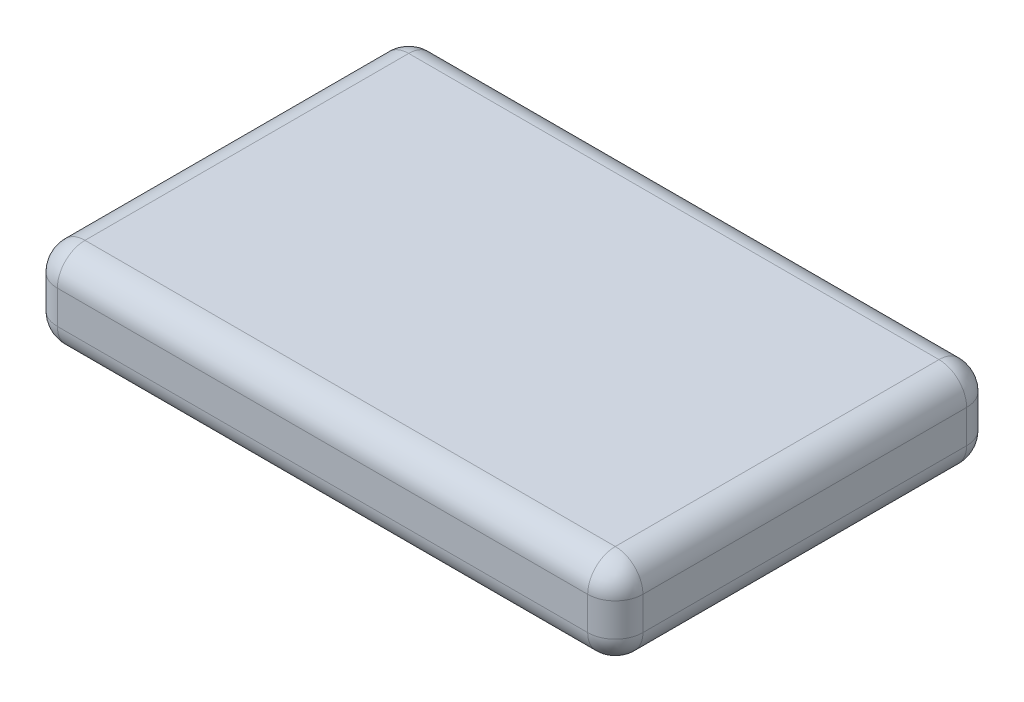
ISO-10303-21;
HEADER;
FILE_DESCRIPTION(('STEP AP214'),'2;1');
FILE_NAME('part.step','',(''),(''),'','','');
FILE_SCHEMA(('AUTOMOTIVE_DESIGN { 1 0 10303 214 1 1 1 1 }'));
ENDSEC;
DATA;
#1=APPLICATION_CONTEXT('core data for automotive mechanical design processes');
#2=APPLICATION_PROTOCOL_DEFINITION('international standard','automotive_design',2000,#1);
#3=PRODUCT_CONTEXT('',#1,'mechanical');
#4=PRODUCT('Part','Part','',(#3));
#5=PRODUCT_RELATED_PRODUCT_CATEGORY('part','',(#4));
#6=PRODUCT_DEFINITION_FORMATION('','',#4);
#7=PRODUCT_DEFINITION_CONTEXT('part definition',#1,'design');
#8=PRODUCT_DEFINITION('design','',#6,#7);
#9=PRODUCT_DEFINITION_SHAPE('','',#8);
#10=(LENGTH_UNIT() NAMED_UNIT(*) SI_UNIT(.MILLI.,.METRE.));
#11=(NAMED_UNIT(*) PLANE_ANGLE_UNIT() SI_UNIT($,.RADIAN.));
#12=(NAMED_UNIT(*) SI_UNIT($,.STERADIAN.) SOLID_ANGLE_UNIT());
#13=UNCERTAINTY_MEASURE_WITH_UNIT(LENGTH_MEASURE(1.E-05),#10,'distance_accuracy_value','');
#14=(GEOMETRIC_REPRESENTATION_CONTEXT(3) GLOBAL_UNCERTAINTY_ASSIGNED_CONTEXT((#13)) GLOBAL_UNIT_ASSIGNED_CONTEXT((#10,
#11,#12)) REPRESENTATION_CONTEXT('',''));
#15=CARTESIAN_POINT('',(0.,0.,0.));
#16=DIRECTION('',(0.,0.,1.));
#17=DIRECTION('',(1.,0.,0.));
#18=AXIS2_PLACEMENT_3D('',#15,#16,#17);
#19=CARTESIAN_POINT('',(53.,8.,34.3));
#20=DIRECTION('',(-1.,0.,0.));
#21=DIRECTION('',(0.,0.,1.));
#22=AXIS2_PLACEMENT_3D('',#19,#20,#21);
#23=PLANE('',#22);
#24=DIRECTION('',(0.,-1.,0.));
#25=VECTOR('',#24,1.);
#26=CARTESIAN_POINT('',(53.,8.,29.3));
#27=LINE('',#26,#25);
#28=CARTESIAN_POINT('',(53.,3.,29.3));
#29=VERTEX_POINT('',#28);
#30=CARTESIAN_POINT('',(53.,-3.,29.3));
#31=VERTEX_POINT('',#30);
#32=EDGE_CURVE('E136',#29,#31,#27,.T.);
#33=ORIENTED_EDGE('',*,*,#32,.T.);
#34=DIRECTION('',(0.,0.,-1.));
#35=VECTOR('',#34,1.);
#36=CARTESIAN_POINT('',(53.,-3.,-29.3));
#37=LINE('',#36,#35);
#38=CARTESIAN_POINT('',(53.,-3.,-29.3));
#39=VERTEX_POINT('',#38);
#40=EDGE_CURVE('E132',#31,#39,#37,.T.);
#41=ORIENTED_EDGE('',*,*,#40,.T.);
#42=DIRECTION('',(0.,-1.,0.));
#43=VECTOR('',#42,1.);
#44=CARTESIAN_POINT('',(53.,8.,-29.3));
#45=LINE('',#44,#43);
#46=CARTESIAN_POINT('',(53.,3.,-29.3));
#47=VERTEX_POINT('',#46);
#48=EDGE_CURVE('E134',#39,#47,#45,.F.);
#49=ORIENTED_EDGE('',*,*,#48,.T.);
#50=DIRECTION('',(0.,0.,-1.));
#51=VECTOR('',#50,1.);
#52=CARTESIAN_POINT('',(53.,3.,34.3));
#53=LINE('',#52,#51);
#54=EDGE_CURVE('E141',#47,#29,#53,.F.);
#55=ORIENTED_EDGE('',*,*,#54,.T.);
#56=EDGE_LOOP('',(#33,#41,#49,#55));
#57=FACE_BOUND('',#56,.T.);
#58=ADVANCED_FACE('F41',(#57),#23,.F.);
#59=CARTESIAN_POINT('',(-53.,8.,-34.3));
#60=DIRECTION('',(0.,0.,1.));
#61=DIRECTION('',(1.,0.,0.));
#62=AXIS2_PLACEMENT_3D('',#59,#60,#61);
#63=PLANE('',#62);
#64=DIRECTION('',(0.,-1.,0.));
#65=VECTOR('',#64,1.);
#66=CARTESIAN_POINT('',(-48.,8.,-34.3));
#67=LINE('',#66,#65);
#68=CARTESIAN_POINT('',(-48.,-3.,-34.3));
#69=VERTEX_POINT('',#68);
#70=CARTESIAN_POINT('',(-48.,3.,-34.3));
#71=VERTEX_POINT('',#70);
#72=EDGE_CURVE('E230',#69,#71,#67,.F.);
#73=ORIENTED_EDGE('',*,*,#72,.T.);
#74=DIRECTION('',(-1.,0.,0.));
#75=VECTOR('',#74,1.);
#76=CARTESIAN_POINT('',(-53.,3.,-34.3));
#77=LINE('',#76,#75);
#78=CARTESIAN_POINT('',(48.,3.,-34.3));
#79=VERTEX_POINT('',#78);
#80=EDGE_CURVE('E11',#71,#79,#77,.F.);
#81=ORIENTED_EDGE('',*,*,#80,.T.);
#82=DIRECTION('',(0.,-1.,0.));
#83=VECTOR('',#82,1.);
#84=CARTESIAN_POINT('',(48.,8.,-34.3));
#85=LINE('',#84,#83);
#86=CARTESIAN_POINT('',(48.,-3.,-34.3));
#87=VERTEX_POINT('',#86);
#88=EDGE_CURVE('E232',#79,#87,#85,.T.);
#89=ORIENTED_EDGE('',*,*,#88,.T.);
#90=DIRECTION('',(-1.,0.,0.));
#91=VECTOR('',#90,1.);
#92=CARTESIAN_POINT('',(-48.,-3.,-34.3));
#93=LINE('',#92,#91);
#94=EDGE_CURVE('E50',#87,#69,#93,.T.);
#95=ORIENTED_EDGE('',*,*,#94,.T.);
#96=EDGE_LOOP('',(#73,#81,#89,#95));
#97=FACE_BOUND('',#96,.T.);
#98=ADVANCED_FACE('F229',(#97),#63,.F.);
#99=CARTESIAN_POINT('',(-53.,8.,34.3));
#100=DIRECTION('',(1.,0.,0.));
#101=DIRECTION('',(0.,0.,-1.));
#102=AXIS2_PLACEMENT_3D('',#99,#100,#101);
#103=PLANE('',#102);
#104=DIRECTION('',(0.,-1.,0.));
#105=VECTOR('',#104,1.);
#106=CARTESIAN_POINT('',(-53.,8.,-29.3));
#107=LINE('',#106,#105);
#108=CARTESIAN_POINT('',(-53.,3.,-29.3));
#109=VERTEX_POINT('',#108);
#110=CARTESIAN_POINT('',(-53.,-3.,-29.3));
#111=VERTEX_POINT('',#110);
#112=EDGE_CURVE('E571',#109,#111,#107,.T.);
#113=ORIENTED_EDGE('',*,*,#112,.T.);
#114=DIRECTION('',(0.,0.,1.));
#115=VECTOR('',#114,1.);
#116=CARTESIAN_POINT('',(-53.,-3.,29.3));
#117=LINE('',#116,#115);
#118=CARTESIAN_POINT('',(-53.,-3.,29.3));
#119=VERTEX_POINT('',#118);
#120=EDGE_CURVE('E271',#111,#119,#117,.T.);
#121=ORIENTED_EDGE('',*,*,#120,.T.);
#122=DIRECTION('',(0.,-1.,0.));
#123=VECTOR('',#122,1.);
#124=CARTESIAN_POINT('',(-53.,8.,29.3));
#125=LINE('',#124,#123);
#126=CARTESIAN_POINT('',(-53.,3.,29.3));
#127=VERTEX_POINT('',#126);
#128=EDGE_CURVE('E190',#119,#127,#125,.F.);
#129=ORIENTED_EDGE('',*,*,#128,.T.);
#130=DIRECTION('',(0.,0.,1.));
#131=VECTOR('',#130,1.);
#132=CARTESIAN_POINT('',(-53.,3.,34.3));
#133=LINE('',#132,#131);
#134=EDGE_CURVE('E212',#127,#109,#133,.F.);
#135=ORIENTED_EDGE('',*,*,#134,.T.);
#136=EDGE_LOOP('',(#113,#121,#129,#135));
#137=FACE_BOUND('',#136,.T.);
#138=ADVANCED_FACE('F299',(#137),#103,.F.);
#139=CARTESIAN_POINT('',(-53.,8.,34.3));
#140=DIRECTION('',(0.,0.,-1.));
#141=DIRECTION('',(-1.,0.,0.));
#142=AXIS2_PLACEMENT_3D('',#139,#140,#141);
#143=PLANE('',#142);
#144=DIRECTION('',(0.,-1.,0.));
#145=VECTOR('',#144,1.);
#146=CARTESIAN_POINT('',(-48.,8.,34.3));
#147=LINE('',#146,#145);
#148=CARTESIAN_POINT('',(-48.,3.,34.3));
#149=VERTEX_POINT('',#148);
#150=CARTESIAN_POINT('',(-48.,-3.,34.3));
#151=VERTEX_POINT('',#150);
#152=EDGE_CURVE('E153',#149,#151,#147,.T.);
#153=ORIENTED_EDGE('',*,*,#152,.T.);
#154=DIRECTION('',(1.,0.,0.));
#155=VECTOR('',#154,1.);
#156=CARTESIAN_POINT('',(48.,-3.,34.3));
#157=LINE('',#156,#155);
#158=CARTESIAN_POINT('',(48.,-3.,34.3));
#159=VERTEX_POINT('',#158);
#160=EDGE_CURVE('E265',#151,#159,#157,.T.);
#161=ORIENTED_EDGE('',*,*,#160,.T.);
#162=DIRECTION('',(0.,-1.,0.));
#163=VECTOR('',#162,1.);
#164=CARTESIAN_POINT('',(48.,8.,34.3));
#165=LINE('',#164,#163);
#166=CARTESIAN_POINT('',(48.,3.,34.3));
#167=VERTEX_POINT('',#166);
#168=EDGE_CURVE('E585',#159,#167,#165,.F.);
#169=ORIENTED_EDGE('',*,*,#168,.T.);
#170=DIRECTION('',(1.,0.,0.));
#171=VECTOR('',#170,1.);
#172=CARTESIAN_POINT('',(-53.,3.,34.3));
#173=LINE('',#172,#171);
#174=EDGE_CURVE('E263',#167,#149,#173,.F.);
#175=ORIENTED_EDGE('',*,*,#174,.T.);
#176=EDGE_LOOP('',(#153,#161,#169,#175));
#177=FACE_BOUND('',#176,.T.);
#178=ADVANCED_FACE('F515',(#177),#143,.F.);
#179=CARTESIAN_POINT('',(0.,8.,0.));
#180=DIRECTION('',(0.,-1.,0.));
#181=DIRECTION('',(0.,0.,-1.));
#182=AXIS2_PLACEMENT_3D('',#179,#180,#181);
#183=PLANE('',#182);
#184=DIRECTION('',(1.,0.,0.));
#185=VECTOR('',#184,1.);
#186=CARTESIAN_POINT('',(0.,8.,29.3));
#187=LINE('',#186,#185);
#188=CARTESIAN_POINT('',(-48.,8.,29.3));
#189=VERTEX_POINT('',#188);
#190=CARTESIAN_POINT('',(48.,8.,29.3));
#191=VERTEX_POINT('',#190);
#192=EDGE_CURVE('E58',#189,#191,#187,.T.);
#193=ORIENTED_EDGE('',*,*,#192,.T.);
#194=DIRECTION('',(0.,0.,-1.));
#195=VECTOR('',#194,1.);
#196=CARTESIAN_POINT('',(48.,8.,0.));
#197=LINE('',#196,#195);
#198=CARTESIAN_POINT('',(48.,8.,-29.3));
#199=VERTEX_POINT('',#198);
#200=EDGE_CURVE('E220',#191,#199,#197,.T.);
#201=ORIENTED_EDGE('',*,*,#200,.T.);
#202=DIRECTION('',(-1.,0.,0.));
#203=VECTOR('',#202,1.);
#204=CARTESIAN_POINT('',(0.,8.,-29.3));
#205=LINE('',#204,#203);
#206=CARTESIAN_POINT('',(-48.,8.,-29.3));
#207=VERTEX_POINT('',#206);
#208=EDGE_CURVE('E223',#199,#207,#205,.T.);
#209=ORIENTED_EDGE('',*,*,#208,.T.);
#210=DIRECTION('',(0.,0.,1.));
#211=VECTOR('',#210,1.);
#212=CARTESIAN_POINT('',(-48.,8.,0.));
#213=LINE('',#212,#211);
#214=EDGE_CURVE('E63',#207,#189,#213,.T.);
#215=ORIENTED_EDGE('',*,*,#214,.T.);
#216=EDGE_LOOP('',(#193,#201,#209,#215));
#217=FACE_BOUND('',#216,.T.);
#218=ADVANCED_FACE('F274',(#217),#183,.F.);
#219=CARTESIAN_POINT('',(0.,-8.,0.));
#220=DIRECTION('',(0.,-1.,0.));
#221=DIRECTION('',(0.,0.,-1.));
#222=AXIS2_PLACEMENT_3D('',#219,#220,#221);
#223=PLANE('',#222);
#224=DIRECTION('',(-1.,0.,0.));
#225=VECTOR('',#224,1.);
#226=CARTESIAN_POINT('',(48.,-8.,-29.3));
#227=LINE('',#226,#225);
#228=CARTESIAN_POINT('',(-48.,-8.,-29.3));
#229=VERTEX_POINT('',#228);
#230=CARTESIAN_POINT('',(48.,-8.,-29.3));
#231=VERTEX_POINT('',#230);
#232=EDGE_CURVE('E140',#229,#231,#227,.F.);
#233=ORIENTED_EDGE('',*,*,#232,.T.);
#234=DIRECTION('',(0.,0.,-1.));
#235=VECTOR('',#234,1.);
#236=CARTESIAN_POINT('',(48.,-8.,29.3));
#237=LINE('',#236,#235);
#238=CARTESIAN_POINT('',(48.,-8.,29.3));
#239=VERTEX_POINT('',#238);
#240=EDGE_CURVE('E166',#231,#239,#237,.F.);
#241=ORIENTED_EDGE('',*,*,#240,.T.);
#242=DIRECTION('',(1.,0.,0.));
#243=VECTOR('',#242,1.);
#244=CARTESIAN_POINT('',(-48.,-8.,29.3));
#245=LINE('',#244,#243);
#246=CARTESIAN_POINT('',(-48.,-8.,29.3));
#247=VERTEX_POINT('',#246);
#248=EDGE_CURVE('E253',#239,#247,#245,.F.);
#249=ORIENTED_EDGE('',*,*,#248,.T.);
#250=DIRECTION('',(0.,0.,1.));
#251=VECTOR('',#250,1.);
#252=CARTESIAN_POINT('',(-48.,-8.,-29.3));
#253=LINE('',#252,#251);
#254=EDGE_CURVE('E251',#247,#229,#253,.F.);
#255=ORIENTED_EDGE('',*,*,#254,.T.);
#256=EDGE_LOOP('',(#233,#241,#249,#255));
#257=FACE_BOUND('',#256,.T.);
#258=ADVANCED_FACE('F305',(#257),#223,.T.);
#259=CARTESIAN_POINT('',(-48.,8.,-29.3));
#260=DIRECTION('',(0.,-1.,0.));
#261=DIRECTION('',(0.,0.,-1.));
#262=AXIS2_PLACEMENT_3D('',#259,#260,#261);
#263=CYLINDRICAL_SURFACE('',#262,5.);
#264=ORIENTED_EDGE('',*,*,#72,.F.);
#265=CARTESIAN_POINT('',(-48.,-3.,-29.3));
#266=DIRECTION('',(0.,-1.,0.));
#267=DIRECTION('',(0.,0.,-1.));
#268=AXIS2_PLACEMENT_3D('',#265,#266,#267);
#269=CIRCLE('',#268,5.);
#270=EDGE_CURVE('E238',#69,#111,#269,.F.);
#271=ORIENTED_EDGE('',*,*,#270,.T.);
#272=ORIENTED_EDGE('',*,*,#112,.F.);
#273=CARTESIAN_POINT('',(-48.,3.,-29.3));
#274=DIRECTION('',(0.,-1.,0.));
#275=DIRECTION('',(0.,0.,-1.));
#276=AXIS2_PLACEMENT_3D('',#273,#274,#275);
#277=CIRCLE('',#276,5.);
#278=EDGE_CURVE('E241',#109,#71,#277,.T.);
#279=ORIENTED_EDGE('',*,*,#278,.T.);
#280=EDGE_LOOP('',(#264,#271,#272,#279));
#281=FACE_BOUND('',#280,.T.);
#282=ADVANCED_FACE('F236',(#281),#263,.T.);
#283=CARTESIAN_POINT('',(48.,8.,-29.3));
#284=DIRECTION('',(0.,-1.,0.));
#285=DIRECTION('',(0.,0.,-1.));
#286=AXIS2_PLACEMENT_3D('',#283,#284,#285);
#287=CYLINDRICAL_SURFACE('',#286,5.);
#288=ORIENTED_EDGE('',*,*,#48,.F.);
#289=CARTESIAN_POINT('',(48.,-3.,-29.3));
#290=DIRECTION('',(0.,-1.,0.));
#291=DIRECTION('',(0.,0.,-1.));
#292=AXIS2_PLACEMENT_3D('',#289,#290,#291);
#293=CIRCLE('',#292,5.);
#294=EDGE_CURVE('E149',#39,#87,#293,.F.);
#295=ORIENTED_EDGE('',*,*,#294,.T.);
#296=ORIENTED_EDGE('',*,*,#88,.F.);
#297=CARTESIAN_POINT('',(48.,3.,-29.3));
#298=DIRECTION('',(0.,-1.,0.));
#299=DIRECTION('',(0.,0.,-1.));
#300=AXIS2_PLACEMENT_3D('',#297,#298,#299);
#301=CIRCLE('',#300,5.);
#302=EDGE_CURVE('E152',#79,#47,#301,.T.);
#303=ORIENTED_EDGE('',*,*,#302,.T.);
#304=EDGE_LOOP('',(#288,#295,#296,#303));
#305=FACE_BOUND('',#304,.T.);
#306=ADVANCED_FACE('F147',(#305),#287,.T.);
#307=CARTESIAN_POINT('',(48.,8.,29.3));
#308=DIRECTION('',(0.,-1.,0.));
#309=DIRECTION('',(0.,0.,-1.));
#310=AXIS2_PLACEMENT_3D('',#307,#308,#309);
#311=CYLINDRICAL_SURFACE('',#310,5.);
#312=ORIENTED_EDGE('',*,*,#168,.F.);
#313=CARTESIAN_POINT('',(48.,-3.,29.3));
#314=DIRECTION('',(0.,-1.,0.));
#315=DIRECTION('',(0.,0.,-1.));
#316=AXIS2_PLACEMENT_3D('',#313,#314,#315);
#317=CIRCLE('',#316,5.);
#318=EDGE_CURVE('E261',#159,#31,#317,.F.);
#319=ORIENTED_EDGE('',*,*,#318,.T.);
#320=ORIENTED_EDGE('',*,*,#32,.F.);
#321=CARTESIAN_POINT('',(48.,3.,29.3));
#322=DIRECTION('',(0.,-1.,0.));
#323=DIRECTION('',(0.,0.,-1.));
#324=AXIS2_PLACEMENT_3D('',#321,#322,#323);
#325=CIRCLE('',#324,5.);
#326=EDGE_CURVE('E259',#29,#167,#325,.T.);
#327=ORIENTED_EDGE('',*,*,#326,.T.);
#328=EDGE_LOOP('',(#312,#319,#320,#327));
#329=FACE_BOUND('',#328,.T.);
#330=ADVANCED_FACE('F308',(#329),#311,.T.);
#331=CARTESIAN_POINT('',(-48.,8.,29.3));
#332=DIRECTION('',(0.,-1.,0.));
#333=DIRECTION('',(0.,0.,-1.));
#334=AXIS2_PLACEMENT_3D('',#331,#332,#333);
#335=CYLINDRICAL_SURFACE('',#334,5.);
#336=ORIENTED_EDGE('',*,*,#128,.F.);
#337=CARTESIAN_POINT('',(-48.,-3.,29.3));
#338=DIRECTION('',(0.,-1.,0.));
#339=DIRECTION('',(0.,0.,-1.));
#340=AXIS2_PLACEMENT_3D('',#337,#338,#339);
#341=CIRCLE('',#340,5.);
#342=EDGE_CURVE('E268',#119,#151,#341,.F.);
#343=ORIENTED_EDGE('',*,*,#342,.T.);
#344=ORIENTED_EDGE('',*,*,#152,.F.);
#345=CARTESIAN_POINT('',(-48.,3.,29.3));
#346=DIRECTION('',(0.,-1.,0.));
#347=DIRECTION('',(0.,0.,-1.));
#348=AXIS2_PLACEMENT_3D('',#345,#346,#347);
#349=CIRCLE('',#348,5.);
#350=EDGE_CURVE('E215',#149,#127,#349,.T.);
#351=ORIENTED_EDGE('',*,*,#350,.T.);
#352=EDGE_LOOP('',(#336,#343,#344,#351));
#353=FACE_BOUND('',#352,.T.);
#354=ADVANCED_FACE('F311',(#353),#335,.T.);
#355=CARTESIAN_POINT('',(-48.,-3.,29.3));
#356=DIRECTION('',(0.,-1.,0.));
#357=DIRECTION('',(0.,0.,-1.));
#358=AXIS2_PLACEMENT_3D('',#355,#356,#357);
#359=SPHERICAL_SURFACE('',#358,5.);
#360=CARTESIAN_POINT('',(-48.,-3.,29.3));
#361=DIRECTION('',(1.,0.,0.));
#362=DIRECTION('',(0.,0.,-1.));
#363=AXIS2_PLACEMENT_3D('',#360,#361,#362);
#364=CIRCLE('',#363,5.);
#365=EDGE_CURVE('E184',#151,#247,#364,.T.);
#366=ORIENTED_EDGE('',*,*,#365,.F.);
#367=ORIENTED_EDGE('',*,*,#342,.F.);
#368=CARTESIAN_POINT('',(-48.,-3.,29.3));
#369=DIRECTION('',(0.,0.,-1.));
#370=DIRECTION('',(-1.,0.,0.));
#371=AXIS2_PLACEMENT_3D('',#368,#369,#370);
#372=CIRCLE('',#371,5.);
#373=EDGE_CURVE('E187',#247,#119,#372,.T.);
#374=ORIENTED_EDGE('',*,*,#373,.F.);
#375=EDGE_LOOP('',(#366,#367,#374));
#376=FACE_BOUND('',#375,.T.);
#377=ADVANCED_FACE('F315',(#376),#359,.T.);
#378=CARTESIAN_POINT('',(-48.,-3.,34.3));
#379=DIRECTION('',(0.,0.,-1.));
#380=DIRECTION('',(-1.,0.,0.));
#381=AXIS2_PLACEMENT_3D('',#378,#379,#380);
#382=CYLINDRICAL_SURFACE('',#381,5.);
#383=ORIENTED_EDGE('',*,*,#373,.T.);
#384=ORIENTED_EDGE('',*,*,#120,.F.);
#385=CARTESIAN_POINT('',(-48.,-3.,-29.3));
#386=DIRECTION('',(0.,0.,-1.));
#387=DIRECTION('',(-1.,0.,0.));
#388=AXIS2_PLACEMENT_3D('',#385,#386,#387);
#389=CIRCLE('',#388,5.);
#390=EDGE_CURVE('E181',#229,#111,#389,.T.);
#391=ORIENTED_EDGE('',*,*,#390,.F.);
#392=ORIENTED_EDGE('',*,*,#254,.F.);
#393=EDGE_LOOP('',(#383,#384,#391,#392));
#394=FACE_BOUND('',#393,.T.);
#395=ADVANCED_FACE('F332',(#394),#382,.T.);
#396=CARTESIAN_POINT('',(-53.,-3.,29.3));
#397=DIRECTION('',(-1.,0.,0.));
#398=DIRECTION('',(0.,0.,1.));
#399=AXIS2_PLACEMENT_3D('',#396,#397,#398);
#400=CYLINDRICAL_SURFACE('',#399,5.);
#401=ORIENTED_EDGE('',*,*,#365,.T.);
#402=ORIENTED_EDGE('',*,*,#248,.F.);
#403=CARTESIAN_POINT('',(48.,-3.,29.3));
#404=DIRECTION('',(1.,0.,0.));
#405=DIRECTION('',(0.,1.,0.));
#406=AXIS2_PLACEMENT_3D('',#403,#404,#405);
#407=CIRCLE('',#406,5.);
#408=EDGE_CURVE('E178',#159,#239,#407,.T.);
#409=ORIENTED_EDGE('',*,*,#408,.F.);
#410=ORIENTED_EDGE('',*,*,#160,.F.);
#411=EDGE_LOOP('',(#401,#402,#409,#410));
#412=FACE_BOUND('',#411,.T.);
#413=ADVANCED_FACE('F329',(#412),#400,.T.);
#414=CARTESIAN_POINT('',(-48.,-3.,-29.3));
#415=DIRECTION('',(0.,-1.,0.));
#416=DIRECTION('',(0.,0.,-1.));
#417=AXIS2_PLACEMENT_3D('',#414,#415,#416);
#418=SPHERICAL_SURFACE('',#417,5.);
#419=ORIENTED_EDGE('',*,*,#390,.T.);
#420=ORIENTED_EDGE('',*,*,#270,.F.);
#421=CARTESIAN_POINT('',(-48.,-3.,-29.3));
#422=DIRECTION('',(1.,0.,0.));
#423=DIRECTION('',(0.,0.,-1.));
#424=AXIS2_PLACEMENT_3D('',#421,#422,#423);
#425=CIRCLE('',#424,5.);
#426=EDGE_CURVE('E175',#229,#69,#425,.T.);
#427=ORIENTED_EDGE('',*,*,#426,.F.);
#428=EDGE_LOOP('',(#419,#420,#427));
#429=FACE_BOUND('',#428,.T.);
#430=ADVANCED_FACE('F245',(#429),#418,.T.);
#431=CARTESIAN_POINT('',(48.,-3.,29.3));
#432=DIRECTION('',(0.,-1.,0.));
#433=DIRECTION('',(0.,0.,-1.));
#434=AXIS2_PLACEMENT_3D('',#431,#432,#433);
#435=SPHERICAL_SURFACE('',#434,5.);
#436=ORIENTED_EDGE('',*,*,#318,.F.);
#437=ORIENTED_EDGE('',*,*,#408,.T.);
#438=CARTESIAN_POINT('',(48.,-3.,29.3));
#439=DIRECTION('',(0.,0.,-1.));
#440=DIRECTION('',(-1.,0.,0.));
#441=AXIS2_PLACEMENT_3D('',#438,#439,#440);
#442=CIRCLE('',#441,5.);
#443=EDGE_CURVE('E168',#31,#239,#442,.T.);
#444=ORIENTED_EDGE('',*,*,#443,.F.);
#445=EDGE_LOOP('',(#436,#437,#444));
#446=FACE_BOUND('',#445,.T.);
#447=ADVANCED_FACE('F323',(#446),#435,.T.);
#448=CARTESIAN_POINT('',(-53.,-3.,-29.3));
#449=DIRECTION('',(1.,0.,0.));
#450=DIRECTION('',(0.,0.,-1.));
#451=AXIS2_PLACEMENT_3D('',#448,#449,#450);
#452=CYLINDRICAL_SURFACE('',#451,5.);
#453=ORIENTED_EDGE('',*,*,#426,.T.);
#454=ORIENTED_EDGE('',*,*,#94,.F.);
#455=CARTESIAN_POINT('',(48.,-3.,-29.3));
#456=DIRECTION('',(1.,0.,0.));
#457=DIRECTION('',(0.,0.,-1.));
#458=AXIS2_PLACEMENT_3D('',#455,#456,#457);
#459=CIRCLE('',#458,5.);
#460=EDGE_CURVE('E160',#231,#87,#459,.T.);
#461=ORIENTED_EDGE('',*,*,#460,.F.);
#462=ORIENTED_EDGE('',*,*,#232,.F.);
#463=EDGE_LOOP('',(#453,#454,#461,#462));
#464=FACE_BOUND('',#463,.T.);
#465=ADVANCED_FACE('F249',(#464),#452,.T.);
#466=CARTESIAN_POINT('',(48.,-3.,34.3));
#467=DIRECTION('',(0.,0.,1.));
#468=DIRECTION('',(1.,0.,0.));
#469=AXIS2_PLACEMENT_3D('',#466,#467,#468);
#470=CYLINDRICAL_SURFACE('',#469,5.);
#471=ORIENTED_EDGE('',*,*,#443,.T.);
#472=ORIENTED_EDGE('',*,*,#240,.F.);
#473=CARTESIAN_POINT('',(48.,-3.,-29.3));
#474=DIRECTION('',(0.,0.,-1.));
#475=DIRECTION('',(0.,1.,0.));
#476=AXIS2_PLACEMENT_3D('',#473,#474,#475);
#477=CIRCLE('',#476,5.);
#478=EDGE_CURVE('E158',#39,#231,#477,.T.);
#479=ORIENTED_EDGE('',*,*,#478,.F.);
#480=ORIENTED_EDGE('',*,*,#40,.F.);
#481=EDGE_LOOP('',(#471,#472,#479,#480));
#482=FACE_BOUND('',#481,.T.);
#483=ADVANCED_FACE('F164',(#482),#470,.T.);
#484=CARTESIAN_POINT('',(48.,-3.,-29.3));
#485=DIRECTION('',(0.,-1.,0.));
#486=DIRECTION('',(0.,0.,-1.));
#487=AXIS2_PLACEMENT_3D('',#484,#485,#486);
#488=SPHERICAL_SURFACE('',#487,5.);
#489=ORIENTED_EDGE('',*,*,#460,.T.);
#490=ORIENTED_EDGE('',*,*,#294,.F.);
#491=ORIENTED_EDGE('',*,*,#478,.T.);
#492=EDGE_LOOP('',(#489,#490,#491));
#493=FACE_BOUND('',#492,.T.);
#494=ADVANCED_FACE('F157',(#493),#488,.T.);
#495=CARTESIAN_POINT('',(-48.,3.,29.3));
#496=DIRECTION('',(0.,-1.,0.));
#497=DIRECTION('',(0.,0.,-1.));
#498=AXIS2_PLACEMENT_3D('',#495,#496,#497);
#499=SPHERICAL_SURFACE('',#498,5.);
#500=CARTESIAN_POINT('',(-48.,3.,29.3));
#501=DIRECTION('',(0.,0.,-1.));
#502=DIRECTION('',(-1.,0.,0.));
#503=AXIS2_PLACEMENT_3D('',#500,#501,#502);
#504=CIRCLE('',#503,5.);
#505=EDGE_CURVE('E171',#127,#189,#504,.T.);
#506=ORIENTED_EDGE('',*,*,#505,.F.);
#507=ORIENTED_EDGE('',*,*,#350,.F.);
#508=CARTESIAN_POINT('',(-48.,3.,29.3));
#509=DIRECTION('',(1.,0.,0.));
#510=DIRECTION('',(0.,0.,-1.));
#511=AXIS2_PLACEMENT_3D('',#508,#509,#510);
#512=CIRCLE('',#511,5.);
#513=EDGE_CURVE('E45',#189,#149,#512,.T.);
#514=ORIENTED_EDGE('',*,*,#513,.F.);
#515=EDGE_LOOP('',(#506,#507,#514));
#516=FACE_BOUND('',#515,.T.);
#517=ADVANCED_FACE('F43',(#516),#499,.T.);
#518=CARTESIAN_POINT('',(0.,3.,29.3));
#519=DIRECTION('',(1.,0.,0.));
#520=DIRECTION('',(0.,0.,-1.));
#521=AXIS2_PLACEMENT_3D('',#518,#519,#520);
#522=CYLINDRICAL_SURFACE('',#521,5.);
#523=ORIENTED_EDGE('',*,*,#513,.T.);
#524=ORIENTED_EDGE('',*,*,#174,.F.);
#525=CARTESIAN_POINT('',(48.,3.,29.3));
#526=DIRECTION('',(1.,0.,0.));
#527=DIRECTION('',(0.,0.,-1.));
#528=AXIS2_PLACEMENT_3D('',#525,#526,#527);
#529=CIRCLE('',#528,5.);
#530=EDGE_CURVE('E204',#191,#167,#529,.T.);
#531=ORIENTED_EDGE('',*,*,#530,.F.);
#532=ORIENTED_EDGE('',*,*,#192,.F.);
#533=EDGE_LOOP('',(#523,#524,#531,#532));
#534=FACE_BOUND('',#533,.T.);
#535=ADVANCED_FACE('F218',(#534),#522,.T.);
#536=CARTESIAN_POINT('',(-48.,3.,0.));
#537=DIRECTION('',(0.,0.,1.));
#538=DIRECTION('',(1.,0.,0.));
#539=AXIS2_PLACEMENT_3D('',#536,#537,#538);
#540=CYLINDRICAL_SURFACE('',#539,5.);
#541=ORIENTED_EDGE('',*,*,#505,.T.);
#542=ORIENTED_EDGE('',*,*,#214,.F.);
#543=CARTESIAN_POINT('',(-48.,3.,-29.3));
#544=DIRECTION('',(0.,0.,-1.));
#545=DIRECTION('',(-1.,0.,0.));
#546=AXIS2_PLACEMENT_3D('',#543,#544,#545);
#547=CIRCLE('',#546,5.);
#548=EDGE_CURVE('E201',#109,#207,#547,.T.);
#549=ORIENTED_EDGE('',*,*,#548,.F.);
#550=ORIENTED_EDGE('',*,*,#134,.F.);
#551=EDGE_LOOP('',(#541,#542,#549,#550));
#552=FACE_BOUND('',#551,.T.);
#553=ADVANCED_FACE('F210',(#552),#540,.T.);
#554=CARTESIAN_POINT('',(48.,3.,29.3));
#555=DIRECTION('',(0.,-1.,0.));
#556=DIRECTION('',(0.,0.,-1.));
#557=AXIS2_PLACEMENT_3D('',#554,#555,#556);
#558=SPHERICAL_SURFACE('',#557,5.);
#559=ORIENTED_EDGE('',*,*,#530,.T.);
#560=ORIENTED_EDGE('',*,*,#326,.F.);
#561=CARTESIAN_POINT('',(48.,3.,29.3));
#562=DIRECTION('',(0.,0.,-1.));
#563=DIRECTION('',(-1.,0.,0.));
#564=AXIS2_PLACEMENT_3D('',#561,#562,#563);
#565=CIRCLE('',#564,5.);
#566=EDGE_CURVE('E198',#191,#29,#565,.T.);
#567=ORIENTED_EDGE('',*,*,#566,.F.);
#568=EDGE_LOOP('',(#559,#560,#567));
#569=FACE_BOUND('',#568,.T.);
#570=ADVANCED_FACE('F284',(#569),#558,.T.);
#571=CARTESIAN_POINT('',(-48.,3.,-29.3));
#572=DIRECTION('',(0.,-1.,0.));
#573=DIRECTION('',(0.,0.,-1.));
#574=AXIS2_PLACEMENT_3D('',#571,#572,#573);
#575=SPHERICAL_SURFACE('',#574,5.);
#576=ORIENTED_EDGE('',*,*,#278,.F.);
#577=ORIENTED_EDGE('',*,*,#548,.T.);
#578=CARTESIAN_POINT('',(-48.,3.,-29.3));
#579=DIRECTION('',(1.,0.,0.));
#580=DIRECTION('',(0.,0.,-1.));
#581=AXIS2_PLACEMENT_3D('',#578,#579,#580);
#582=CIRCLE('',#581,5.);
#583=EDGE_CURVE('E195',#71,#207,#582,.T.);
#584=ORIENTED_EDGE('',*,*,#583,.F.);
#585=EDGE_LOOP('',(#576,#577,#584));
#586=FACE_BOUND('',#585,.T.);
#587=ADVANCED_FACE('F281',(#586),#575,.T.);
#588=CARTESIAN_POINT('',(48.,3.,0.));
#589=DIRECTION('',(0.,0.,-1.));
#590=DIRECTION('',(-1.,0.,0.));
#591=AXIS2_PLACEMENT_3D('',#588,#589,#590);
#592=CYLINDRICAL_SURFACE('',#591,5.);
#593=ORIENTED_EDGE('',*,*,#566,.T.);
#594=ORIENTED_EDGE('',*,*,#54,.F.);
#595=CARTESIAN_POINT('',(48.,3.,-29.3));
#596=DIRECTION('',(0.,0.,-1.));
#597=DIRECTION('',(-1.,0.,0.));
#598=AXIS2_PLACEMENT_3D('',#595,#596,#597);
#599=CIRCLE('',#598,5.);
#600=EDGE_CURVE('E193',#199,#47,#599,.T.);
#601=ORIENTED_EDGE('',*,*,#600,.F.);
#602=ORIENTED_EDGE('',*,*,#200,.F.);
#603=EDGE_LOOP('',(#593,#594,#601,#602));
#604=FACE_BOUND('',#603,.T.);
#605=ADVANCED_FACE('F283',(#604),#592,.T.);
#606=CARTESIAN_POINT('',(0.,3.,-29.3));
#607=DIRECTION('',(-1.,0.,0.));
#608=DIRECTION('',(0.,0.,1.));
#609=AXIS2_PLACEMENT_3D('',#606,#607,#608);
#610=CYLINDRICAL_SURFACE('',#609,5.);
#611=ORIENTED_EDGE('',*,*,#583,.T.);
#612=ORIENTED_EDGE('',*,*,#208,.F.);
#613=CARTESIAN_POINT('',(48.,3.,-29.3));
#614=DIRECTION('',(1.,0.,0.));
#615=DIRECTION('',(0.,0.,-1.));
#616=AXIS2_PLACEMENT_3D('',#613,#614,#615);
#617=CIRCLE('',#616,5.);
#618=EDGE_CURVE('E191',#79,#199,#617,.T.);
#619=ORIENTED_EDGE('',*,*,#618,.F.);
#620=ORIENTED_EDGE('',*,*,#80,.F.);
#621=EDGE_LOOP('',(#611,#612,#619,#620));
#622=FACE_BOUND('',#621,.T.);
#623=ADVANCED_FACE('F278',(#622),#610,.T.);
#624=CARTESIAN_POINT('',(48.,3.,-29.3));
#625=DIRECTION('',(0.,-1.,0.));
#626=DIRECTION('',(0.,0.,-1.));
#627=AXIS2_PLACEMENT_3D('',#624,#625,#626);
#628=SPHERICAL_SURFACE('',#627,5.);
#629=ORIENTED_EDGE('',*,*,#600,.T.);
#630=ORIENTED_EDGE('',*,*,#302,.F.);
#631=ORIENTED_EDGE('',*,*,#618,.T.);
#632=EDGE_LOOP('',(#629,#630,#631));
#633=FACE_BOUND('',#632,.T.);
#634=ADVANCED_FACE('F340',(#633),#628,.T.);
#635=CLOSED_SHELL('',(#58,#98,#138,#178,#218,#258,#282,#306,#330,#354,#377,#395,#413,#430,#447,
#465,#483,#494,#517,#535,#553,#570,#587,#605,#623,#634));
#636=MANIFOLD_SOLID_BREP('B2',#635);
#637=ADVANCED_BREP_SHAPE_REPRESENTATION('',(#18,#636),#14);
#638=SHAPE_DEFINITION_REPRESENTATION(#9,#637);
ENDSEC;
END-ISO-10303-21;
